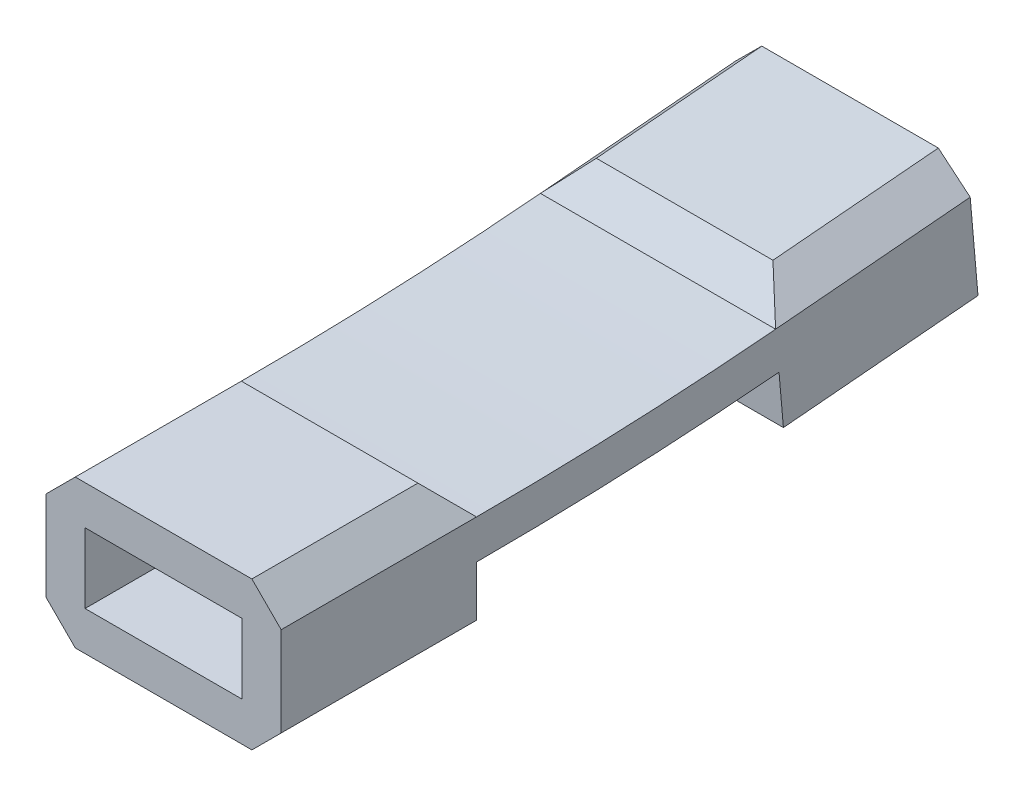
ISO-10303-21;
HEADER;
FILE_DESCRIPTION(('STEP AP214'),'2;1');
FILE_NAME('part.step','',(''),(''),'','','');
FILE_SCHEMA(('AUTOMOTIVE_DESIGN { 1 0 10303 214 1 1 1 1 }'));
ENDSEC;
DATA;
#1=APPLICATION_CONTEXT('core data for automotive mechanical design processes');
#2=APPLICATION_PROTOCOL_DEFINITION('international standard','automotive_design',2000,#1);
#3=PRODUCT_CONTEXT('',#1,'mechanical');
#4=PRODUCT('Part','Part','',(#3));
#5=PRODUCT_RELATED_PRODUCT_CATEGORY('part','',(#4));
#6=PRODUCT_DEFINITION_FORMATION('','',#4);
#7=PRODUCT_DEFINITION_CONTEXT('part definition',#1,'design');
#8=PRODUCT_DEFINITION('design','',#6,#7);
#9=PRODUCT_DEFINITION_SHAPE('','',#8);
#10=(LENGTH_UNIT() NAMED_UNIT(*) SI_UNIT(.MILLI.,.METRE.));
#11=(NAMED_UNIT(*) PLANE_ANGLE_UNIT() SI_UNIT($,.RADIAN.));
#12=(NAMED_UNIT(*) SI_UNIT($,.STERADIAN.) SOLID_ANGLE_UNIT());
#13=UNCERTAINTY_MEASURE_WITH_UNIT(LENGTH_MEASURE(1.E-05),#10,'distance_accuracy_value','');
#14=(GEOMETRIC_REPRESENTATION_CONTEXT(3) GLOBAL_UNCERTAINTY_ASSIGNED_CONTEXT((#13)) GLOBAL_UNIT_ASSIGNED_CONTEXT((#10,
#11,#12)) REPRESENTATION_CONTEXT('',''));
#15=CARTESIAN_POINT('',(0.,0.,0.));
#16=DIRECTION('',(0.,0.,1.));
#17=DIRECTION('',(1.,0.,0.));
#18=AXIS2_PLACEMENT_3D('',#15,#16,#17);
#19=CARTESIAN_POINT('',(0.,0.,8.));
#20=DIRECTION('',(0.,0.,1.));
#21=DIRECTION('',(1.,0.,0.));
#22=AXIS2_PLACEMENT_3D('',#19,#20,#21);
#23=PLANE('',#22);
#24=DIRECTION('',(0.,-1.,0.));
#25=VECTOR('',#24,1.);
#26=CARTESIAN_POINT('',(-6.02,3.79,8.));
#27=LINE('',#26,#25);
#28=CARTESIAN_POINT('',(-6.02,2.29,8.));
#29=VERTEX_POINT('',#28);
#30=CARTESIAN_POINT('',(-6.02,-2.29,8.));
#31=VERTEX_POINT('',#30);
#32=EDGE_CURVE('E332',#29,#31,#27,.T.);
#33=ORIENTED_EDGE('',*,*,#32,.T.);
#34=DIRECTION('',(-0.707106781186548,0.707106781186547,0.));
#35=VECTOR('',#34,1.);
#36=CARTESIAN_POINT('',(-4.15499999999999,-4.155,8.));
#37=LINE('',#36,#35);
#38=CARTESIAN_POINT('',(-4.52,-3.79,8.));
#39=VERTEX_POINT('',#38);
#40=EDGE_CURVE('E395',#31,#39,#37,.F.);
#41=ORIENTED_EDGE('',*,*,#40,.T.);
#42=DIRECTION('',(1.,0.,0.));
#43=VECTOR('',#42,1.);
#44=CARTESIAN_POINT('',(-6.02,-3.79,8.));
#45=LINE('',#44,#43);
#46=CARTESIAN_POINT('',(4.52,-3.79,8.));
#47=VERTEX_POINT('',#46);
#48=EDGE_CURVE('E335',#39,#47,#45,.T.);
#49=ORIENTED_EDGE('',*,*,#48,.T.);
#50=DIRECTION('',(-0.707106781186548,-0.707106781186547,0.));
#51=VECTOR('',#50,1.);
#52=CARTESIAN_POINT('',(4.15499999999999,-4.155,8.));
#53=LINE('',#52,#51);
#54=CARTESIAN_POINT('',(6.02,-2.29,8.));
#55=VERTEX_POINT('',#54);
#56=EDGE_CURVE('E393',#47,#55,#53,.F.);
#57=ORIENTED_EDGE('',*,*,#56,.T.);
#58=DIRECTION('',(0.,1.,0.));
#59=VECTOR('',#58,1.);
#60=CARTESIAN_POINT('',(6.02,3.79,8.));
#61=LINE('',#60,#59);
#62=CARTESIAN_POINT('',(6.02,2.29,8.));
#63=VERTEX_POINT('',#62);
#64=EDGE_CURVE('E326',#55,#63,#61,.T.);
#65=ORIENTED_EDGE('',*,*,#64,.T.);
#66=DIRECTION('',(0.707106781186549,-0.707106781186546,0.));
#67=VECTOR('',#66,1.);
#68=CARTESIAN_POINT('',(4.15499999999999,4.15500000000001,8.));
#69=LINE('',#68,#67);
#70=CARTESIAN_POINT('',(4.52,3.79,8.));
#71=VERTEX_POINT('',#70);
#72=EDGE_CURVE('E391',#63,#71,#69,.F.);
#73=ORIENTED_EDGE('',*,*,#72,.T.);
#74=DIRECTION('',(-1.,0.,0.));
#75=VECTOR('',#74,1.);
#76=CARTESIAN_POINT('',(-6.02,3.79,8.));
#77=LINE('',#76,#75);
#78=CARTESIAN_POINT('',(-4.52,3.79,8.));
#79=VERTEX_POINT('',#78);
#80=EDGE_CURVE('E329',#71,#79,#77,.T.);
#81=ORIENTED_EDGE('',*,*,#80,.T.);
#82=DIRECTION('',(0.707106781186549,0.707106781186546,0.));
#83=VECTOR('',#82,1.);
#84=CARTESIAN_POINT('',(-4.15499999999999,4.15500000000001,8.));
#85=LINE('',#84,#83);
#86=EDGE_CURVE('E389',#79,#29,#85,.F.);
#87=ORIENTED_EDGE('',*,*,#86,.T.);
#88=EDGE_LOOP('',(#33,#41,#49,#57,#65,#73,#81,#87));
#89=FACE_BOUND('',#88,.T.);
#90=DIRECTION('',(1.,0.,0.));
#91=VECTOR('',#90,1.);
#92=CARTESIAN_POINT('',(4.02,-1.79,8.));
#93=LINE('',#92,#91);
#94=CARTESIAN_POINT('',(-4.02,-1.79,8.));
#95=VERTEX_POINT('',#94);
#96=CARTESIAN_POINT('',(4.02,-1.79,8.));
#97=VERTEX_POINT('',#96);
#98=EDGE_CURVE('E299',#95,#97,#93,.T.);
#99=ORIENTED_EDGE('',*,*,#98,.F.);
#100=DIRECTION('',(0.,-1.,0.));
#101=VECTOR('',#100,1.);
#102=CARTESIAN_POINT('',(-4.02,-1.79,8.));
#103=LINE('',#102,#101);
#104=CARTESIAN_POINT('',(-4.02,1.79,8.));
#105=VERTEX_POINT('',#104);
#106=EDGE_CURVE('E297',#105,#95,#103,.T.);
#107=ORIENTED_EDGE('',*,*,#106,.F.);
#108=DIRECTION('',(-1.,0.,0.));
#109=VECTOR('',#108,1.);
#110=CARTESIAN_POINT('',(4.02,1.79,8.));
#111=LINE('',#110,#109);
#112=CARTESIAN_POINT('',(4.02,1.79,8.));
#113=VERTEX_POINT('',#112);
#114=EDGE_CURVE('E305',#113,#105,#111,.T.);
#115=ORIENTED_EDGE('',*,*,#114,.F.);
#116=DIRECTION('',(0.,1.,0.));
#117=VECTOR('',#116,1.);
#118=CARTESIAN_POINT('',(4.02,-1.79,8.));
#119=LINE('',#118,#117);
#120=EDGE_CURVE('E302',#97,#113,#119,.T.);
#121=ORIENTED_EDGE('',*,*,#120,.F.);
#122=EDGE_LOOP('',(#99,#107,#115,#121));
#123=FACE_BOUND('',#122,.T.);
#124=ADVANCED_FACE('F45',(#89,#123),#23,.T.);
#125=CARTESIAN_POINT('',(6.02,3.79,8.));
#126=DIRECTION('',(-1.,0.,0.));
#127=DIRECTION('',(0.,0.,1.));
#128=AXIS2_PLACEMENT_3D('',#125,#126,#127);
#129=PLANE('',#128);
#130=DIRECTION('',(0.,0.996194698091746,0.0871557427476519));
#131=VECTOR('',#130,1.);
#132=CARTESIAN_POINT('',(6.02,2.39703672718649,-27.3982551633835));
#133=LINE('',#132,#131);
#134=CARTESIAN_POINT('',(6.02,-0.732523221810741,-27.6720561807455));
#135=VERTEX_POINT('',#134);
#136=CARTESIAN_POINT('',(6.02,3.83004849544945,-27.2728828789612));
#137=VERTEX_POINT('',#136);
#138=EDGE_CURVE('E247',#135,#137,#133,.T.);
#139=ORIENTED_EDGE('',*,*,#138,.T.);
#140=DIRECTION('',(0.,-0.0871557427476518,0.996194698091746));
#141=VECTOR('',#140,1.);
#142=CARTESIAN_POINT('',(6.02,2.95849106797294,-17.3109358980438));
#143=LINE('',#142,#141);
#144=CARTESIAN_POINT('',(6.02,2.95849106797316,-17.3109358980438));
#145=VERTEX_POINT('',#144);
#146=EDGE_CURVE('E371',#137,#145,#143,.T.);
#147=ORIENTED_EDGE('',*,*,#146,.T.);
#148=CARTESIAN_POINT('',(6.02,177.962981760271,-2.));
#149=DIRECTION('',(1.,0.,0.));
#150=DIRECTION('',(0.,-1.,0.));
#151=AXIS2_PLACEMENT_3D('',#148,#149,#150);
#152=CIRCLE('',#151,175.672981760271);
#153=CARTESIAN_POINT('',(6.02,2.28999999999985,-2.));
#154=VERTEX_POINT('',#153);
#155=EDGE_CURVE('E281',#154,#145,#152,.T.);
#156=ORIENTED_EDGE('',*,*,#155,.F.);
#157=DIRECTION('',(0.,0.,1.));
#158=VECTOR('',#157,1.);
#159=CARTESIAN_POINT('',(6.02,2.29,8.));
#160=LINE('',#159,#158);
#161=EDGE_CURVE('E365',#154,#63,#160,.T.);
#162=ORIENTED_EDGE('',*,*,#161,.T.);
#163=ORIENTED_EDGE('',*,*,#64,.F.);
#164=DIRECTION('',(0.,0.,-1.));
#165=VECTOR('',#164,1.);
#166=CARTESIAN_POINT('',(6.02,-2.29,8.));
#167=LINE('',#166,#165);
#168=CARTESIAN_POINT('',(6.02,-2.29,-2.));
#169=VERTEX_POINT('',#168);
#170=EDGE_CURVE('E367',#55,#169,#167,.T.);
#171=ORIENTED_EDGE('',*,*,#170,.T.);
#172=DIRECTION('',(0.,-1.,0.));
#173=VECTOR('',#172,1.);
#174=CARTESIAN_POINT('',(6.02,0.,-2.));
#175=LINE('',#174,#173);
#176=CARTESIAN_POINT('',(6.02,0.289999999999999,-2.));
#177=VERTEX_POINT('',#176);
#178=EDGE_CURVE('E278',#177,#169,#175,.T.);
#179=ORIENTED_EDGE('',*,*,#178,.F.);
#180=CARTESIAN_POINT('',(6.02,177.962981760271,-2.));
#181=DIRECTION('',(1.,0.,0.));
#182=DIRECTION('',(0.,0.,-1.));
#183=AXIS2_PLACEMENT_3D('',#180,#181,#182);
#184=CIRCLE('',#183,177.672981760271);
#185=CARTESIAN_POINT('',(6.02,0.966101671789676,-17.4852473835391));
#186=VERTEX_POINT('',#185);
#187=EDGE_CURVE('E284',#177,#186,#184,.T.);
#188=ORIENTED_EDGE('',*,*,#187,.T.);
#189=DIRECTION('',(0.,-0.996194698091746,-0.0871557427476509));
#190=VECTOR('',#189,1.);
#191=CARTESIAN_POINT('',(6.02,0.966101671789449,-17.4852473835391));
#192=LINE('',#191,#190);
#193=CARTESIAN_POINT('',(6.02,-1.60408064928725,-17.710109199828));
#194=VERTEX_POINT('',#193);
#195=EDGE_CURVE('E268',#186,#194,#192,.T.);
#196=ORIENTED_EDGE('',*,*,#195,.T.);
#197=DIRECTION('',(0.,0.0871557427476509,-0.996194698091746));
#198=VECTOR('',#197,1.);
#199=CARTESIAN_POINT('',(6.02,-3.79536335162301,7.33636669800804));
#200=LINE('',#199,#198);
#201=EDGE_CURVE('E369',#194,#135,#200,.T.);
#202=ORIENTED_EDGE('',*,*,#201,.T.);
#203=EDGE_LOOP('',(#139,#147,#156,#162,#163,#171,#179,#188,#196,#202));
#204=FACE_BOUND('',#203,.T.);
#205=ADVANCED_FACE('F435',(#204),#129,.F.);
#206=CARTESIAN_POINT('',(-6.02,3.79,8.));
#207=DIRECTION('',(0.,-1.,0.));
#208=DIRECTION('',(0.,0.,-1.));
#209=AXIS2_PLACEMENT_3D('',#206,#207,#208);
#210=PLANE('',#209);
#211=ORIENTED_EDGE('',*,*,#80,.F.);
#212=DIRECTION('',(0.,0.,-1.));
#213=VECTOR('',#212,1.);
#214=CARTESIAN_POINT('',(4.52,3.79,8.));
#215=LINE('',#214,#213);
#216=CARTESIAN_POINT('',(4.52,3.79,-0.499999999999998));
#217=VERTEX_POINT('',#216);
#218=EDGE_CURVE('E11',#71,#217,#215,.T.);
#219=ORIENTED_EDGE('',*,*,#218,.T.);
#220=DIRECTION('',(-1.,0.,0.));
#221=VECTOR('',#220,1.);
#222=CARTESIAN_POINT('',(-6.02,3.79,-0.499999999999999));
#223=LINE('',#222,#221);
#224=CARTESIAN_POINT('',(-4.52,3.79,-0.499999999999998));
#225=VERTEX_POINT('',#224);
#226=EDGE_CURVE('E55',#217,#225,#223,.T.);
#227=ORIENTED_EDGE('',*,*,#226,.T.);
#228=DIRECTION('',(0.,0.,1.));
#229=VECTOR('',#228,1.);
#230=CARTESIAN_POINT('',(-4.52,3.79,8.));
#231=LINE('',#230,#229);
#232=EDGE_CURVE('E399',#225,#79,#231,.T.);
#233=ORIENTED_EDGE('',*,*,#232,.T.);
#234=EDGE_LOOP('',(#211,#219,#227,#233));
#235=FACE_BOUND('',#234,.T.);
#236=ADVANCED_FACE('F426',(#235),#210,.F.);
#237=CARTESIAN_POINT('',(-6.02,3.79,8.));
#238=DIRECTION('',(1.,0.,0.));
#239=DIRECTION('',(0.,0.,-1.));
#240=AXIS2_PLACEMENT_3D('',#237,#238,#239);
#241=PLANE('',#240);
#242=CARTESIAN_POINT('',(-6.02,177.962981760271,-2.));
#243=DIRECTION('',(1.,0.,0.));
#244=DIRECTION('',(0.,0.,-1.));
#245=AXIS2_PLACEMENT_3D('',#242,#243,#244);
#246=CIRCLE('',#245,175.672981760271);
#247=CARTESIAN_POINT('',(-6.02,2.95849106797316,-17.3109358980438));
#248=VERTEX_POINT('',#247);
#249=CARTESIAN_POINT('',(-6.02,2.28999999999985,-2.));
#250=VERTEX_POINT('',#249);
#251=EDGE_CURVE('E269',#248,#250,#246,.F.);
#252=ORIENTED_EDGE('',*,*,#251,.F.);
#253=DIRECTION('',(0.,0.0871557427476518,-0.996194698091746));
#254=VECTOR('',#253,1.);
#255=CARTESIAN_POINT('',(-6.02,3.83004849544945,-27.2728828789612));
#256=LINE('',#255,#254);
#257=CARTESIAN_POINT('',(-6.02,3.83004849544945,-27.2728828789612));
#258=VERTEX_POINT('',#257);
#259=EDGE_CURVE('E355',#248,#258,#256,.T.);
#260=ORIENTED_EDGE('',*,*,#259,.T.);
#261=DIRECTION('',(0.,-0.996194698091746,-0.0871557427476519));
#262=VECTOR('',#261,1.);
#263=CARTESIAN_POINT('',(-6.02,2.39703672718649,-27.3982551633835));
#264=LINE('',#263,#262);
#265=CARTESIAN_POINT('',(-6.02,-0.732523221810741,-27.6720561807455));
#266=VERTEX_POINT('',#265);
#267=EDGE_CURVE('E460',#258,#266,#264,.T.);
#268=ORIENTED_EDGE('',*,*,#267,.T.);
#269=DIRECTION('',(0.,-0.0871557427476509,0.996194698091746));
#270=VECTOR('',#269,1.);
#271=CARTESIAN_POINT('',(-6.02,-3.79536335162301,7.33636669800804));
#272=LINE('',#271,#270);
#273=CARTESIAN_POINT('',(-6.02,-1.60408064928725,-17.710109199828));
#274=VERTEX_POINT('',#273);
#275=EDGE_CURVE('E353',#266,#274,#272,.T.);
#276=ORIENTED_EDGE('',*,*,#275,.T.);
#277=DIRECTION('',(0.,0.996194698091746,0.0871557427476509));
#278=VECTOR('',#277,1.);
#279=CARTESIAN_POINT('',(-6.02,0.966101671789449,-17.4852473835391));
#280=LINE('',#279,#278);
#281=CARTESIAN_POINT('',(-6.02,0.966101671789649,-17.4852473835391));
#282=VERTEX_POINT('',#281);
#283=EDGE_CURVE('E276',#274,#282,#280,.T.);
#284=ORIENTED_EDGE('',*,*,#283,.T.);
#285=CARTESIAN_POINT('',(-6.02,177.962981760271,-2.));
#286=DIRECTION('',(1.,0.,0.));
#287=DIRECTION('',(0.,0.,-1.));
#288=AXIS2_PLACEMENT_3D('',#285,#286,#287);
#289=CIRCLE('',#288,177.672981760271);
#290=CARTESIAN_POINT('',(-6.02,0.289999999999846,-2.));
#291=VERTEX_POINT('',#290);
#292=EDGE_CURVE('E272',#282,#291,#289,.F.);
#293=ORIENTED_EDGE('',*,*,#292,.T.);
#294=DIRECTION('',(0.,-1.,0.));
#295=VECTOR('',#294,1.);
#296=CARTESIAN_POINT('',(-6.02,0.,-2.));
#297=LINE('',#296,#295);
#298=CARTESIAN_POINT('',(-6.02,-2.29,-2.));
#299=VERTEX_POINT('',#298);
#300=EDGE_CURVE('E293',#291,#299,#297,.T.);
#301=ORIENTED_EDGE('',*,*,#300,.T.);
#302=DIRECTION('',(0.,0.,1.));
#303=VECTOR('',#302,1.);
#304=CARTESIAN_POINT('',(-6.02,-2.29,8.));
#305=LINE('',#304,#303);
#306=EDGE_CURVE('E351',#299,#31,#305,.T.);
#307=ORIENTED_EDGE('',*,*,#306,.T.);
#308=ORIENTED_EDGE('',*,*,#32,.F.);
#309=DIRECTION('',(0.,0.,-1.));
#310=VECTOR('',#309,1.);
#311=CARTESIAN_POINT('',(-6.02,2.29,8.));
#312=LINE('',#311,#310);
#313=EDGE_CURVE('E349',#29,#250,#312,.T.);
#314=ORIENTED_EDGE('',*,*,#313,.T.);
#315=EDGE_LOOP('',(#252,#260,#268,#276,#284,#293,#301,#307,#308,#314));
#316=FACE_BOUND('',#315,.T.);
#317=ADVANCED_FACE('F459',(#316),#241,.F.);
#318=CARTESIAN_POINT('',(-6.02,-3.79,8.));
#319=DIRECTION('',(0.,1.,0.));
#320=DIRECTION('',(0.,0.,1.));
#321=AXIS2_PLACEMENT_3D('',#318,#319,#320);
#322=PLANE('',#321);
#323=ORIENTED_EDGE('',*,*,#48,.F.);
#324=DIRECTION('',(0.,0.,-1.));
#325=VECTOR('',#324,1.);
#326=CARTESIAN_POINT('',(-4.52,-3.79,8.));
#327=LINE('',#326,#325);
#328=CARTESIAN_POINT('',(-4.52,-3.79,-0.499999999999995));
#329=VERTEX_POINT('',#328);
#330=EDGE_CURVE('E386',#39,#329,#327,.T.);
#331=ORIENTED_EDGE('',*,*,#330,.T.);
#332=DIRECTION('',(1.,0.,0.));
#333=VECTOR('',#332,1.);
#334=CARTESIAN_POINT('',(-6.02,-3.79,-0.499999999999995));
#335=LINE('',#334,#333);
#336=CARTESIAN_POINT('',(4.52,-3.79,-0.499999999999995));
#337=VERTEX_POINT('',#336);
#338=EDGE_CURVE('E384',#329,#337,#335,.T.);
#339=ORIENTED_EDGE('',*,*,#338,.T.);
#340=DIRECTION('',(0.,0.,1.));
#341=VECTOR('',#340,1.);
#342=CARTESIAN_POINT('',(4.52,-3.79,8.));
#343=LINE('',#342,#341);
#344=EDGE_CURVE('E382',#337,#47,#343,.T.);
#345=ORIENTED_EDGE('',*,*,#344,.T.);
#346=EDGE_LOOP('',(#323,#331,#339,#345));
#347=FACE_BOUND('',#346,.T.);
#348=ADVANCED_FACE('F515',(#347),#322,.F.);
#349=CARTESIAN_POINT('',(-4.02,-1.79,8.));
#350=DIRECTION('',(1.,0.,0.));
#351=DIRECTION('',(0.,0.,-1.));
#352=AXIS2_PLACEMENT_3D('',#349,#350,#351);
#353=PLANE('',#352);
#354=DIRECTION('',(0.,-1.,0.));
#355=VECTOR('',#354,1.);
#356=CARTESIAN_POINT('',(-4.02,-1.79,0.));
#357=LINE('',#356,#355);
#358=CARTESIAN_POINT('',(-4.02,1.79,0.));
#359=VERTEX_POINT('',#358);
#360=CARTESIAN_POINT('',(-4.02,-1.79,0.));
#361=VERTEX_POINT('',#360);
#362=EDGE_CURVE('E296',#359,#361,#357,.T.);
#363=ORIENTED_EDGE('',*,*,#362,.F.);
#364=DIRECTION('',(0.,0.,-1.));
#365=VECTOR('',#364,1.);
#366=CARTESIAN_POINT('',(-4.02,1.79,8.));
#367=LINE('',#366,#365);
#368=EDGE_CURVE('E307',#105,#359,#367,.T.);
#369=ORIENTED_EDGE('',*,*,#368,.F.);
#370=ORIENTED_EDGE('',*,*,#106,.T.);
#371=DIRECTION('',(0.,0.,-1.));
#372=VECTOR('',#371,1.);
#373=CARTESIAN_POINT('',(-4.02,-1.79,8.));
#374=LINE('',#373,#372);
#375=EDGE_CURVE('E323',#95,#361,#374,.T.);
#376=ORIENTED_EDGE('',*,*,#375,.T.);
#377=EDGE_LOOP('',(#363,#369,#370,#376));
#378=FACE_BOUND('',#377,.T.);
#379=ADVANCED_FACE('F538',(#378),#353,.T.);
#380=CARTESIAN_POINT('',(4.02,-1.79,8.));
#381=DIRECTION('',(0.,1.,0.));
#382=DIRECTION('',(0.,0.,1.));
#383=AXIS2_PLACEMENT_3D('',#380,#381,#382);
#384=PLANE('',#383);
#385=DIRECTION('',(1.,0.,0.));
#386=VECTOR('',#385,1.);
#387=CARTESIAN_POINT('',(4.02,-1.79,0.));
#388=LINE('',#387,#386);
#389=CARTESIAN_POINT('',(4.02,-1.79,0.));
#390=VERTEX_POINT('',#389);
#391=EDGE_CURVE('E310',#361,#390,#388,.T.);
#392=ORIENTED_EDGE('',*,*,#391,.F.);
#393=ORIENTED_EDGE('',*,*,#375,.F.);
#394=ORIENTED_EDGE('',*,*,#98,.T.);
#395=DIRECTION('',(0.,0.,-1.));
#396=VECTOR('',#395,1.);
#397=CARTESIAN_POINT('',(4.02,-1.79,8.));
#398=LINE('',#397,#396);
#399=EDGE_CURVE('E321',#97,#390,#398,.T.);
#400=ORIENTED_EDGE('',*,*,#399,.T.);
#401=EDGE_LOOP('',(#392,#393,#394,#400));
#402=FACE_BOUND('',#401,.T.);
#403=ADVANCED_FACE('F772',(#402),#384,.T.);
#404=CARTESIAN_POINT('',(4.02,-1.79,8.));
#405=DIRECTION('',(-1.,0.,0.));
#406=DIRECTION('',(0.,0.,1.));
#407=AXIS2_PLACEMENT_3D('',#404,#405,#406);
#408=PLANE('',#407);
#409=DIRECTION('',(0.,1.,0.));
#410=VECTOR('',#409,1.);
#411=CARTESIAN_POINT('',(4.02,-1.79,0.));
#412=LINE('',#411,#410);
#413=CARTESIAN_POINT('',(4.02,1.79,0.));
#414=VERTEX_POINT('',#413);
#415=EDGE_CURVE('E313',#390,#414,#412,.T.);
#416=ORIENTED_EDGE('',*,*,#415,.F.);
#417=ORIENTED_EDGE('',*,*,#399,.F.);
#418=ORIENTED_EDGE('',*,*,#120,.T.);
#419=DIRECTION('',(0.,0.,-1.));
#420=VECTOR('',#419,1.);
#421=CARTESIAN_POINT('',(4.02,1.79,8.));
#422=LINE('',#421,#420);
#423=EDGE_CURVE('E319',#113,#414,#422,.T.);
#424=ORIENTED_EDGE('',*,*,#423,.T.);
#425=EDGE_LOOP('',(#416,#417,#418,#424));
#426=FACE_BOUND('',#425,.T.);
#427=ADVANCED_FACE('F760',(#426),#408,.T.);
#428=CARTESIAN_POINT('',(4.02,1.79,8.));
#429=DIRECTION('',(0.,-1.,0.));
#430=DIRECTION('',(0.,0.,-1.));
#431=AXIS2_PLACEMENT_3D('',#428,#429,#430);
#432=PLANE('',#431);
#433=DIRECTION('',(-1.,0.,0.));
#434=VECTOR('',#433,1.);
#435=CARTESIAN_POINT('',(4.02,1.79,0.));
#436=LINE('',#435,#434);
#437=EDGE_CURVE('E300',#414,#359,#436,.T.);
#438=ORIENTED_EDGE('',*,*,#437,.F.);
#439=ORIENTED_EDGE('',*,*,#423,.F.);
#440=ORIENTED_EDGE('',*,*,#114,.T.);
#441=ORIENTED_EDGE('',*,*,#368,.T.);
#442=EDGE_LOOP('',(#438,#439,#440,#441));
#443=FACE_BOUND('',#442,.T.);
#444=ADVANCED_FACE('F754',(#443),#432,.T.);
#445=CARTESIAN_POINT('',(0.,0.,0.));
#446=DIRECTION('',(0.,0.,1.));
#447=DIRECTION('',(1.,0.,0.));
#448=AXIS2_PLACEMENT_3D('',#445,#446,#447);
#449=PLANE('',#448);
#450=ORIENTED_EDGE('',*,*,#437,.T.);
#451=ORIENTED_EDGE('',*,*,#362,.T.);
#452=ORIENTED_EDGE('',*,*,#391,.T.);
#453=ORIENTED_EDGE('',*,*,#415,.T.);
#454=EDGE_LOOP('',(#450,#451,#452,#453));
#455=FACE_BOUND('',#454,.T.);
#456=ADVANCED_FACE('F707',(#455),#449,.T.);
#457=CARTESIAN_POINT('',(0.,0.,-2.));
#458=DIRECTION('',(0.,0.,1.));
#459=DIRECTION('',(1.,0.,0.));
#460=AXIS2_PLACEMENT_3D('',#457,#458,#459);
#461=PLANE('',#460);
#462=ORIENTED_EDGE('',*,*,#178,.T.);
#463=DIRECTION('',(-1.,0.,0.));
#464=VECTOR('',#463,1.);
#465=CARTESIAN_POINT('',(0.,-2.29,-2.));
#466=LINE('',#465,#464);
#467=EDGE_CURVE('E397',#169,#299,#466,.T.);
#468=ORIENTED_EDGE('',*,*,#467,.T.);
#469=ORIENTED_EDGE('',*,*,#300,.F.);
#470=DIRECTION('',(1.,0.,0.));
#471=VECTOR('',#470,1.);
#472=CARTESIAN_POINT('',(-27.0304607877791,0.289999999999999,-2.));
#473=LINE('',#472,#471);
#474=EDGE_CURVE('E287',#291,#177,#473,.T.);
#475=ORIENTED_EDGE('',*,*,#474,.T.);
#476=EDGE_LOOP('',(#462,#468,#469,#475));
#477=FACE_BOUND('',#476,.T.);
#478=ADVANCED_FACE('F500',(#477),#461,.F.);
#479=CARTESIAN_POINT('',(-27.0304607877791,177.962981760271,-2.));
#480=DIRECTION('',(1.,0.,0.));
#481=DIRECTION('',(0.,0.,-1.));
#482=AXIS2_PLACEMENT_3D('',#479,#480,#481);
#483=CYLINDRICAL_SURFACE('',#482,175.672981760271);
#484=ORIENTED_EDGE('',*,*,#155,.T.);
#485=DIRECTION('',(1.,0.,0.));
#486=VECTOR('',#485,1.);
#487=CARTESIAN_POINT('',(-27.0304607877791,2.95849106797316,-17.3109358980438));
#488=LINE('',#487,#486);
#489=EDGE_CURVE('E266',#145,#248,#488,.F.);
#490=ORIENTED_EDGE('',*,*,#489,.T.);
#491=ORIENTED_EDGE('',*,*,#251,.T.);
#492=DIRECTION('',(1.,0.,0.));
#493=VECTOR('',#492,1.);
#494=CARTESIAN_POINT('',(-27.0304607877791,2.28999999999985,-2.));
#495=LINE('',#494,#493);
#496=EDGE_CURVE('E338',#250,#154,#495,.T.);
#497=ORIENTED_EDGE('',*,*,#496,.T.);
#498=EDGE_LOOP('',(#484,#490,#491,#497));
#499=FACE_BOUND('',#498,.T.);
#500=ADVANCED_FACE('F440',(#499),#483,.F.);
#501=CARTESIAN_POINT('',(-27.0304607877791,-2.92406121092958,-19.833232210133));
#502=DIRECTION('',(0.,0.996194698091746,0.0871557427476509));
#503=DIRECTION('',(0.,-0.0871557427476509,0.996194698091746));
#504=AXIS2_PLACEMENT_3D('',#501,#502,#503);
#505=PLANE('',#504);
#506=DIRECTION('',(1.,0.,0.));
#507=VECTOR('',#506,1.);
#508=CARTESIAN_POINT('',(0.,-2.22681526894836,-27.802789794867));
#509=LINE('',#508,#507);
#510=CARTESIAN_POINT('',(-4.52,-2.22681526894836,-27.802789794867));
#511=VERTEX_POINT('',#510);
#512=CARTESIAN_POINT('',(4.52,-2.22681526894836,-27.802789794867));
#513=VERTEX_POINT('',#512);
#514=EDGE_CURVE('E250',#511,#513,#509,.T.);
#515=ORIENTED_EDGE('',*,*,#514,.T.);
#516=DIRECTION('',(0.,-0.0871557427476509,0.996194698091746));
#517=VECTOR('',#516,1.);
#518=CARTESIAN_POINT('',(4.52,-2.92406121092958,-19.833232210133));
#519=LINE('',#518,#517);
#520=CARTESIAN_POINT('',(4.52,-2.9676390823034,-19.3351348610871));
#521=VERTEX_POINT('',#520);
#522=EDGE_CURVE('E377',#513,#521,#519,.T.);
#523=ORIENTED_EDGE('',*,*,#522,.T.);
#524=DIRECTION('',(-1.,0.,0.));
#525=VECTOR('',#524,1.);
#526=CARTESIAN_POINT('',(-6.02,-2.9676390823034,-19.3351348610871));
#527=LINE('',#526,#525);
#528=CARTESIAN_POINT('',(-4.52,-2.9676390823034,-19.3351348610871));
#529=VERTEX_POINT('',#528);
#530=EDGE_CURVE('E375',#521,#529,#527,.T.);
#531=ORIENTED_EDGE('',*,*,#530,.T.);
#532=DIRECTION('',(0.,0.0871557427476509,-0.996194698091746));
#533=VECTOR('',#532,1.);
#534=CARTESIAN_POINT('',(-4.52,-2.92406121092958,-19.833232210133));
#535=LINE('',#534,#533);
#536=EDGE_CURVE('E373',#529,#511,#535,.T.);
#537=ORIENTED_EDGE('',*,*,#536,.T.);
#538=EDGE_LOOP('',(#515,#523,#531,#537));
#539=FACE_BOUND('',#538,.T.);
#540=ADVANCED_FACE('F487',(#539),#505,.F.);
#541=CARTESIAN_POINT('',(-27.0304607877791,177.962981760271,-2.));
#542=DIRECTION('',(1.,0.,0.));
#543=DIRECTION('',(0.,0.,-1.));
#544=AXIS2_PLACEMENT_3D('',#541,#542,#543);
#545=CYLINDRICAL_SURFACE('',#544,177.672981760271);
#546=ORIENTED_EDGE('',*,*,#292,.F.);
#547=DIRECTION('',(1.,0.,0.));
#548=VECTOR('',#547,1.);
#549=CARTESIAN_POINT('',(-27.0304607877791,0.966101671789676,-17.4852473835391));
#550=LINE('',#549,#548);
#551=EDGE_CURVE('E273',#282,#186,#550,.T.);
#552=ORIENTED_EDGE('',*,*,#551,.T.);
#553=ORIENTED_EDGE('',*,*,#187,.F.);
#554=ORIENTED_EDGE('',*,*,#474,.F.);
#555=EDGE_LOOP('',(#546,#552,#553,#554));
#556=FACE_BOUND('',#555,.T.);
#557=ADVANCED_FACE('F496',(#556),#545,.T.);
#558=CARTESIAN_POINT('',(-27.0304607877791,0.966101671789449,-17.4852473835391));
#559=DIRECTION('',(0.,-0.0871557427476509,0.996194698091746));
#560=DIRECTION('',(0.,-0.996194698091746,-0.0871557427476509));
#561=AXIS2_PLACEMENT_3D('',#558,#559,#560);
#562=PLANE('',#561);
#563=ORIENTED_EDGE('',*,*,#283,.F.);
#564=DIRECTION('',(1.,0.,0.));
#565=VECTOR('',#564,1.);
#566=CARTESIAN_POINT('',(6.02,-1.60408064928725,-17.710109199828));
#567=LINE('',#566,#565);
#568=EDGE_CURVE('E380',#274,#194,#567,.T.);
#569=ORIENTED_EDGE('',*,*,#568,.T.);
#570=ORIENTED_EDGE('',*,*,#195,.F.);
#571=ORIENTED_EDGE('',*,*,#551,.F.);
#572=EDGE_LOOP('',(#563,#569,#570,#571));
#573=FACE_BOUND('',#572,.T.);
#574=ADVANCED_FACE('F493',(#573),#562,.T.);
#575=CARTESIAN_POINT('',(0.,3.33195114640358,-27.3164607503351));
#576=DIRECTION('',(0.,-0.996194698091746,-0.0871557427476518));
#577=DIRECTION('',(0.,0.0871557427476518,-0.996194698091746));
#578=AXIS2_PLACEMENT_3D('',#575,#576,#577);
#579=PLANE('',#578);
#580=DIRECTION('',(1.,0.,0.));
#581=VECTOR('',#580,1.);
#582=CARTESIAN_POINT('',(-27.0304607877791,2.63470520442237,-19.3469031656011));
#583=LINE('',#582,#581);
#584=CARTESIAN_POINT('',(-4.02,2.63470520442237,-19.3469031656011));
#585=VERTEX_POINT('',#584);
#586=CARTESIAN_POINT('',(4.02,2.63470520442237,-19.3469031656011));
#587=VERTEX_POINT('',#586);
#588=EDGE_CURVE('E340',#585,#587,#583,.T.);
#589=ORIENTED_EDGE('',*,*,#588,.F.);
#590=DIRECTION('',(0.,-0.0871557427476518,0.996194698091746));
#591=VECTOR('',#590,1.);
#592=CARTESIAN_POINT('',(-4.02,3.33195114640358,-27.3164607503351));
#593=LINE('',#592,#591);
#594=CARTESIAN_POINT('',(-4.02,3.33195114640358,-27.3164607503351));
#595=VERTEX_POINT('',#594);
#596=EDGE_CURVE('E257',#595,#585,#593,.T.);
#597=ORIENTED_EDGE('',*,*,#596,.F.);
#598=DIRECTION('',(1.,0.,0.));
#599=VECTOR('',#598,1.);
#600=CARTESIAN_POINT('',(0.,3.33195114640358,-27.3164607503351));
#601=LINE('',#600,#599);
#602=CARTESIAN_POINT('',(4.02,3.33195114640358,-27.3164607503351));
#603=VERTEX_POINT('',#602);
#604=EDGE_CURVE('E241',#595,#603,#601,.T.);
#605=ORIENTED_EDGE('',*,*,#604,.T.);
#606=DIRECTION('',(0.,-0.0871557427476518,0.996194698091746));
#607=VECTOR('',#606,1.);
#608=CARTESIAN_POINT('',(4.02,3.33195114640358,-27.3164607503351));
#609=LINE('',#608,#607);
#610=EDGE_CURVE('E245',#603,#587,#609,.T.);
#611=ORIENTED_EDGE('',*,*,#610,.T.);
#612=EDGE_LOOP('',(#589,#597,#605,#611));
#613=FACE_BOUND('',#612,.T.);
#614=ADVANCED_FACE('F681',(#613),#579,.T.);
#615=CARTESIAN_POINT('',(4.02,2.39703672718649,-27.3982551633835));
#616=DIRECTION('',(1.,0.,0.));
#617=DIRECTION('',(0.,0.,-1.));
#618=AXIS2_PLACEMENT_3D('',#615,#616,#617);
#619=PLANE('',#618);
#620=DIRECTION('',(0.,-0.0871557427476518,0.996194698091746));
#621=VECTOR('',#620,1.);
#622=CARTESIAN_POINT('',(4.02,-0.234425872764868,-27.6284783093717));
#623=LINE('',#622,#621);
#624=CARTESIAN_POINT('',(4.02,-0.234425872764868,-27.6284783093717));
#625=VERTEX_POINT('',#624);
#626=CARTESIAN_POINT('',(4.02,-0.931671814746083,-19.6589207246377));
#627=VERTEX_POINT('',#626);
#628=EDGE_CURVE('E235',#625,#627,#623,.T.);
#629=ORIENTED_EDGE('',*,*,#628,.T.);
#630=DIRECTION('',(0.,0.996194698091746,0.0871557427476509));
#631=VECTOR('',#630,1.);
#632=CARTESIAN_POINT('',(4.02,1.14041315728475,-19.4776367797226));
#633=LINE('',#632,#631);
#634=EDGE_CURVE('E264',#627,#587,#633,.T.);
#635=ORIENTED_EDGE('',*,*,#634,.T.);
#636=ORIENTED_EDGE('',*,*,#610,.F.);
#637=DIRECTION('',(0.,0.996194698091746,0.0871557427476519));
#638=VECTOR('',#637,1.);
#639=CARTESIAN_POINT('',(4.02,2.39703672718649,-27.3982551633835));
#640=LINE('',#639,#638);
#641=EDGE_CURVE('E226',#625,#603,#640,.T.);
#642=ORIENTED_EDGE('',*,*,#641,.F.);
#643=EDGE_LOOP('',(#629,#635,#636,#642));
#644=FACE_BOUND('',#643,.T.);
#645=ADVANCED_FACE('F243',(#644),#619,.F.);
#646=CARTESIAN_POINT('',(-4.02,2.39703672718649,-27.3982551633835));
#647=DIRECTION('',(1.,0.,0.));
#648=DIRECTION('',(0.,0.,-1.));
#649=AXIS2_PLACEMENT_3D('',#646,#647,#648);
#650=PLANE('',#649);
#651=DIRECTION('',(0.,0.996194698091746,0.0871557427476509));
#652=VECTOR('',#651,1.);
#653=CARTESIAN_POINT('',(-4.02,1.14041315728475,-19.4776367797226));
#654=LINE('',#653,#652);
#655=CARTESIAN_POINT('',(-4.02,-0.931671814746083,-19.6589207246377));
#656=VERTEX_POINT('',#655);
#657=EDGE_CURVE('E262',#656,#585,#654,.T.);
#658=ORIENTED_EDGE('',*,*,#657,.F.);
#659=DIRECTION('',(0.,-0.0871557427476518,0.996194698091746));
#660=VECTOR('',#659,1.);
#661=CARTESIAN_POINT('',(-4.02,-0.234425872764868,-27.6284783093717));
#662=LINE('',#661,#660);
#663=CARTESIAN_POINT('',(-4.02,-0.234425872764868,-27.6284783093717));
#664=VERTEX_POINT('',#663);
#665=EDGE_CURVE('E240',#664,#656,#662,.T.);
#666=ORIENTED_EDGE('',*,*,#665,.F.);
#667=DIRECTION('',(0.,0.996194698091746,0.0871557427476519));
#668=VECTOR('',#667,1.);
#669=CARTESIAN_POINT('',(-4.02,2.39703672718649,-27.3982551633835));
#670=LINE('',#669,#668);
#671=EDGE_CURVE('E229',#664,#595,#670,.T.);
#672=ORIENTED_EDGE('',*,*,#671,.T.);
#673=ORIENTED_EDGE('',*,*,#596,.T.);
#674=EDGE_LOOP('',(#658,#666,#672,#673));
#675=FACE_BOUND('',#674,.T.);
#676=ADVANCED_FACE('F829',(#675),#650,.T.);
#677=CARTESIAN_POINT('',(0.,-0.234425872764868,-27.6284783093717));
#678=DIRECTION('',(0.,-0.996194698091746,-0.0871557427476518));
#679=DIRECTION('',(0.,0.0871557427476518,-0.996194698091746));
#680=AXIS2_PLACEMENT_3D('',#677,#678,#679);
#681=PLANE('',#680);
#682=ORIENTED_EDGE('',*,*,#665,.T.);
#683=DIRECTION('',(1.,0.,0.));
#684=VECTOR('',#683,1.);
#685=CARTESIAN_POINT('',(-27.0304607877791,-0.931671814746083,-19.6589207246377));
#686=LINE('',#685,#684);
#687=EDGE_CURVE('E237',#656,#627,#686,.T.);
#688=ORIENTED_EDGE('',*,*,#687,.T.);
#689=ORIENTED_EDGE('',*,*,#628,.F.);
#690=DIRECTION('',(1.,0.,0.));
#691=VECTOR('',#690,1.);
#692=CARTESIAN_POINT('',(0.,-0.234425872764868,-27.6284783093717));
#693=LINE('',#692,#691);
#694=EDGE_CURVE('E221',#664,#625,#693,.T.);
#695=ORIENTED_EDGE('',*,*,#694,.F.);
#696=EDGE_LOOP('',(#682,#688,#689,#695));
#697=FACE_BOUND('',#696,.T.);
#698=ADVANCED_FACE('F236',(#697),#681,.F.);
#699=CARTESIAN_POINT('',(0.,5.32434054258707,-27.1421492648398));
#700=DIRECTION('',(0.,0.996194698091746,0.0871557427476518));
#701=DIRECTION('',(0.,-0.0871557427476518,0.996194698091746));
#702=AXIS2_PLACEMENT_3D('',#699,#700,#701);
#703=PLANE('',#702);
#704=DIRECTION('',(-1.,0.,0.));
#705=VECTOR('',#704,1.);
#706=CARTESIAN_POINT('',(0.,5.32434054258707,-27.1421492648398));
#707=LINE('',#706,#705);
#708=CARTESIAN_POINT('',(4.52,5.32434054258707,-27.1421492648398));
#709=VERTEX_POINT('',#708);
#710=CARTESIAN_POINT('',(-4.52,5.32434054258707,-27.1421492648398));
#711=VERTEX_POINT('',#710);
#712=EDGE_CURVE('E408',#709,#711,#707,.T.);
#713=ORIENTED_EDGE('',*,*,#712,.T.);
#714=DIRECTION('',(0.,-0.0871557427476518,0.996194698091746));
#715=VECTOR('',#714,1.);
#716=CARTESIAN_POINT('',(-4.52,4.45278311511056,-17.1802022839223));
#717=LINE('',#716,#715);
#718=CARTESIAN_POINT('',(-4.52,4.58351672923204,-18.6744943310599));
#719=VERTEX_POINT('',#718);
#720=EDGE_CURVE('E346',#711,#719,#717,.T.);
#721=ORIENTED_EDGE('',*,*,#720,.T.);
#722=DIRECTION('',(1.,0.,0.));
#723=VECTOR('',#722,1.);
#724=CARTESIAN_POINT('',(0.,4.58351672923204,-18.6744943310599));
#725=LINE('',#724,#723);
#726=CARTESIAN_POINT('',(4.52,4.58351672923204,-18.6744943310599));
#727=VERTEX_POINT('',#726);
#728=EDGE_CURVE('E344',#719,#727,#725,.T.);
#729=ORIENTED_EDGE('',*,*,#728,.T.);
#730=DIRECTION('',(0.,0.0871557427476518,-0.996194698091746));
#731=VECTOR('',#730,1.);
#732=CARTESIAN_POINT('',(4.52,5.32434054258707,-27.1421492648398));
#733=LINE('',#732,#731);
#734=EDGE_CURVE('E342',#727,#709,#733,.T.);
#735=ORIENTED_EDGE('',*,*,#734,.T.);
#736=EDGE_LOOP('',(#713,#721,#729,#735));
#737=FACE_BOUND('',#736,.T.);
#738=ADVANCED_FACE('F471',(#737),#703,.T.);
#739=CARTESIAN_POINT('',(0.,2.39703672718649,-27.3982551633835));
#740=DIRECTION('',(0.,-0.0871557427476519,0.996194698091746));
#741=DIRECTION('',(0.,-0.996194698091746,-0.0871557427476519));
#742=AXIS2_PLACEMENT_3D('',#739,#740,#741);
#743=PLANE('',#742);
#744=ORIENTED_EDGE('',*,*,#267,.F.);
#745=DIRECTION('',(0.707106781186548,0.704416026402758,0.0616284167162148));
#746=VECTOR('',#745,1.);
#747=CARTESIAN_POINT('',(-4.52,5.32434054258707,-27.1421492648398));
#748=LINE('',#747,#746);
#749=EDGE_CURVE('E363',#258,#711,#748,.T.);
#750=ORIENTED_EDGE('',*,*,#749,.T.);
#751=ORIENTED_EDGE('',*,*,#712,.F.);
#752=DIRECTION('',(0.707106781186548,-0.704416026402758,-0.0616284167162149));
#753=VECTOR('',#752,1.);
#754=CARTESIAN_POINT('',(6.02,3.83004849544946,-27.2728828789612));
#755=LINE('',#754,#753);
#756=EDGE_CURVE('E361',#709,#137,#755,.T.);
#757=ORIENTED_EDGE('',*,*,#756,.T.);
#758=ORIENTED_EDGE('',*,*,#138,.F.);
#759=DIRECTION('',(0.707106781186546,0.704416026402761,0.061628416716215));
#760=VECTOR('',#759,1.);
#761=CARTESIAN_POINT('',(4.52,-2.22681526894836,-27.802789794867));
#762=LINE('',#761,#760);
#763=EDGE_CURVE('E359',#135,#513,#762,.F.);
#764=ORIENTED_EDGE('',*,*,#763,.T.);
#765=ORIENTED_EDGE('',*,*,#514,.F.);
#766=DIRECTION('',(0.707106781186546,-0.704416026402761,-0.0616284167162151));
#767=VECTOR('',#766,1.);
#768=CARTESIAN_POINT('',(-4.52,-2.22681526894836,-27.802789794867));
#769=LINE('',#768,#767);
#770=EDGE_CURVE('E357',#511,#266,#769,.F.);
#771=ORIENTED_EDGE('',*,*,#770,.T.);
#772=EDGE_LOOP('',(#744,#750,#751,#757,#758,#764,#765,#771));
#773=FACE_BOUND('',#772,.T.);
#774=ORIENTED_EDGE('',*,*,#641,.T.);
#775=ORIENTED_EDGE('',*,*,#604,.F.);
#776=ORIENTED_EDGE('',*,*,#671,.F.);
#777=ORIENTED_EDGE('',*,*,#694,.T.);
#778=EDGE_LOOP('',(#774,#775,#776,#777));
#779=FACE_BOUND('',#778,.T.);
#780=ADVANCED_FACE('F223',(#773,#779),#743,.F.);
#781=CARTESIAN_POINT('',(-27.0304607877791,1.14041315728475,-19.4776367797226));
#782=DIRECTION('',(0.,-0.0871557427476509,0.996194698091746));
#783=DIRECTION('',(0.,-0.996194698091746,-0.0871557427476509));
#784=AXIS2_PLACEMENT_3D('',#781,#782,#783);
#785=PLANE('',#784);
#786=ORIENTED_EDGE('',*,*,#634,.F.);
#787=ORIENTED_EDGE('',*,*,#687,.F.);
#788=ORIENTED_EDGE('',*,*,#657,.T.);
#789=ORIENTED_EDGE('',*,*,#588,.T.);
#790=EDGE_LOOP('',(#786,#787,#788,#789));
#791=FACE_BOUND('',#790,.T.);
#792=ADVANCED_FACE('F561',(#791),#785,.F.);
#793=CARTESIAN_POINT('',(6.02,0.767208365637153,7.73553999979227));
#794=DIRECTION('',(0.707106781186547,0.70441602640276,0.0616284167162149));
#795=DIRECTION('',(0.,0.0871557427476518,-0.996194698091746));
#796=AXIS2_PLACEMENT_3D('',#793,#794,#795);
#797=PLANE('',#796);
#798=ORIENTED_EDGE('',*,*,#756,.F.);
#799=ORIENTED_EDGE('',*,*,#734,.F.);
#800=DIRECTION('',(-0.577350269189625,0.625472668645325,-0.524833885571771));
#801=VECTOR('',#800,1.);
#802=CARTESIAN_POINT('',(14.4007164555997,-6.12076179875102,-9.6925381662103));
#803=LINE('',#802,#801);
#804=EDGE_CURVE('E404',#145,#727,#803,.T.);
#805=ORIENTED_EDGE('',*,*,#804,.F.);
#806=ORIENTED_EDGE('',*,*,#146,.F.);
#807=EDGE_LOOP('',(#798,#799,#805,#806));
#808=FACE_BOUND('',#807,.T.);
#809=ADVANCED_FACE('F446',(#808),#797,.T.);
#810=CARTESIAN_POINT('',(0.,2.95849106797294,-17.3109358980438));
#811=DIRECTION('',(0.,-0.642787609686546,-0.766044443118972));
#812=DIRECTION('',(-1.,0.,0.));
#813=AXIS2_PLACEMENT_3D('',#810,#811,#812);
#814=PLANE('',#813);
#815=ORIENTED_EDGE('',*,*,#804,.T.);
#816=ORIENTED_EDGE('',*,*,#728,.F.);
#817=DIRECTION('',(0.577350269189625,0.625472668645325,-0.524833885571771));
#818=VECTOR('',#817,1.);
#819=CARTESIAN_POINT('',(-4.01333333333334,5.13241428592399,-19.1350740684343));
#820=LINE('',#819,#818);
#821=EDGE_CURVE('E402',#248,#719,#820,.T.);
#822=ORIENTED_EDGE('',*,*,#821,.F.);
#823=ORIENTED_EDGE('',*,*,#489,.F.);
#824=EDGE_LOOP('',(#815,#816,#822,#823));
#825=FACE_BOUND('',#824,.T.);
#826=ADVANCED_FACE('F450',(#825),#814,.F.);
#827=CARTESIAN_POINT('',(-4.52,5.32434054258707,-27.1421492648398));
#828=DIRECTION('',(-0.707106781186547,0.70441602640276,0.0616284167162149));
#829=DIRECTION('',(0.,0.0871557427476518,-0.996194698091746));
#830=AXIS2_PLACEMENT_3D('',#827,#828,#829);
#831=PLANE('',#830);
#832=ORIENTED_EDGE('',*,*,#749,.F.);
#833=ORIENTED_EDGE('',*,*,#259,.F.);
#834=ORIENTED_EDGE('',*,*,#821,.T.);
#835=ORIENTED_EDGE('',*,*,#720,.F.);
#836=EDGE_LOOP('',(#832,#833,#834,#835));
#837=FACE_BOUND('',#836,.T.);
#838=ADVANCED_FACE('F455',(#837),#831,.T.);
#839=CARTESIAN_POINT('',(-4.52,-2.92406121092958,-19.833232210133));
#840=DIRECTION('',(0.707106781186549,0.704416026402757,0.061628416716214));
#841=DIRECTION('',(0.,0.0871557427476509,-0.996194698091746));
#842=AXIS2_PLACEMENT_3D('',#839,#840,#841);
#843=PLANE('',#842);
#844=ORIENTED_EDGE('',*,*,#770,.F.);
#845=ORIENTED_EDGE('',*,*,#536,.F.);
#846=DIRECTION('',(0.577350269189625,-0.524833885571772,-0.625472668645325));
#847=VECTOR('',#846,1.);
#848=CARTESIAN_POINT('',(-4.35333333333333,-3.11914557486075,-19.5156932678937));
#849=LINE('',#848,#847);
#850=EDGE_CURVE('E405',#274,#529,#849,.T.);
#851=ORIENTED_EDGE('',*,*,#850,.F.);
#852=ORIENTED_EDGE('',*,*,#275,.F.);
#853=EDGE_LOOP('',(#844,#845,#851,#852));
#854=FACE_BOUND('',#853,.T.);
#855=ADVANCED_FACE('F489',(#854),#843,.F.);
#856=CARTESIAN_POINT('',(-27.0304607877791,-1.60408064928725,-17.710109199828));
#857=DIRECTION('',(0.,-0.766044443118972,0.642787609686547));
#858=DIRECTION('',(-1.,0.,0.));
#859=AXIS2_PLACEMENT_3D('',#856,#857,#858);
#860=PLANE('',#859);
#861=ORIENTED_EDGE('',*,*,#850,.T.);
#862=ORIENTED_EDGE('',*,*,#530,.F.);
#863=DIRECTION('',(-0.577350269189625,-0.524833885571772,-0.625472668645325));
#864=VECTOR('',#863,1.);
#865=CARTESIAN_POINT('',(-4.99682026259301,-11.6187994320085,-29.6451862879566));
#866=LINE('',#865,#864);
#867=EDGE_CURVE('E409',#194,#521,#866,.T.);
#868=ORIENTED_EDGE('',*,*,#867,.F.);
#869=ORIENTED_EDGE('',*,*,#568,.F.);
#870=EDGE_LOOP('',(#861,#862,#868,#869));
#871=FACE_BOUND('',#870,.T.);
#872=ADVANCED_FACE('F483',(#871),#860,.T.);
#873=CARTESIAN_POINT('',(4.52,-2.92406121092958,-19.833232210133));
#874=DIRECTION('',(-0.707106781186549,0.704416026402758,0.0616284167162141));
#875=DIRECTION('',(0.,-0.0871557427476509,0.996194698091746));
#876=AXIS2_PLACEMENT_3D('',#873,#874,#875);
#877=PLANE('',#876);
#878=ORIENTED_EDGE('',*,*,#763,.F.);
#879=ORIENTED_EDGE('',*,*,#201,.F.);
#880=ORIENTED_EDGE('',*,*,#867,.T.);
#881=ORIENTED_EDGE('',*,*,#522,.F.);
#882=EDGE_LOOP('',(#878,#879,#880,#881));
#883=FACE_BOUND('',#882,.T.);
#884=ADVANCED_FACE('F478',(#883),#877,.F.);
#885=CARTESIAN_POINT('',(6.02,-2.29,8.));
#886=DIRECTION('',(-0.707106781186547,0.707106781186548,0.));
#887=DIRECTION('',(0.,0.,-1.));
#888=AXIS2_PLACEMENT_3D('',#885,#886,#887);
#889=PLANE('',#888);
#890=ORIENTED_EDGE('',*,*,#56,.F.);
#891=ORIENTED_EDGE('',*,*,#344,.F.);
#892=DIRECTION('',(0.577350269189626,0.577350269189625,-0.577350269189626));
#893=VECTOR('',#892,1.);
#894=CARTESIAN_POINT('',(2.68666666666666,-5.62333333333333,1.33333333333334));
#895=LINE('',#894,#893);
#896=EDGE_CURVE('E411',#169,#337,#895,.F.);
#897=ORIENTED_EDGE('',*,*,#896,.F.);
#898=ORIENTED_EDGE('',*,*,#170,.F.);
#899=EDGE_LOOP('',(#890,#891,#897,#898));
#900=FACE_BOUND('',#899,.T.);
#901=ADVANCED_FACE('F518',(#900),#889,.F.);
#902=CARTESIAN_POINT('',(-6.02,-3.79,-0.499999999999995));
#903=DIRECTION('',(0.,0.707106781186548,0.707106781186547));
#904=DIRECTION('',(1.,0.,0.));
#905=AXIS2_PLACEMENT_3D('',#902,#903,#904);
#906=PLANE('',#905);
#907=ORIENTED_EDGE('',*,*,#896,.T.);
#908=ORIENTED_EDGE('',*,*,#338,.F.);
#909=DIRECTION('',(-0.577350269189626,0.577350269189625,-0.577350269189626));
#910=VECTOR('',#909,1.);
#911=CARTESIAN_POINT('',(-5.02,-3.29,-0.999999999999997));
#912=LINE('',#911,#910);
#913=EDGE_CURVE('E414',#299,#329,#912,.F.);
#914=ORIENTED_EDGE('',*,*,#913,.F.);
#915=ORIENTED_EDGE('',*,*,#467,.F.);
#916=EDGE_LOOP('',(#907,#908,#914,#915));
#917=FACE_BOUND('',#916,.T.);
#918=ADVANCED_FACE('F506',(#917),#906,.F.);
#919=CARTESIAN_POINT('',(-4.52,-3.79,8.));
#920=DIRECTION('',(0.707106781186547,0.707106781186548,0.));
#921=DIRECTION('',(0.,0.,-1.));
#922=AXIS2_PLACEMENT_3D('',#919,#920,#921);
#923=PLANE('',#922);
#924=ORIENTED_EDGE('',*,*,#40,.F.);
#925=ORIENTED_EDGE('',*,*,#306,.F.);
#926=ORIENTED_EDGE('',*,*,#913,.T.);
#927=ORIENTED_EDGE('',*,*,#330,.F.);
#928=EDGE_LOOP('',(#924,#925,#926,#927));
#929=FACE_BOUND('',#928,.T.);
#930=ADVANCED_FACE('F511',(#929),#923,.F.);
#931=CARTESIAN_POINT('',(-6.02,2.29,8.));
#932=DIRECTION('',(0.707106781186546,-0.707106781186549,0.));
#933=DIRECTION('',(0.,0.,-1.));
#934=AXIS2_PLACEMENT_3D('',#931,#932,#933);
#935=PLANE('',#934);
#936=ORIENTED_EDGE('',*,*,#86,.F.);
#937=ORIENTED_EDGE('',*,*,#232,.F.);
#938=DIRECTION('',(-0.577350269189627,-0.577350269189624,-0.577350269189627));
#939=VECTOR('',#938,1.);
#940=CARTESIAN_POINT('',(-2.68666666666666,5.62333333333333,1.33333333333334));
#941=LINE('',#940,#939);
#942=EDGE_CURVE('E50',#250,#225,#941,.F.);
#943=ORIENTED_EDGE('',*,*,#942,.F.);
#944=ORIENTED_EDGE('',*,*,#313,.F.);
#945=EDGE_LOOP('',(#936,#937,#943,#944));
#946=FACE_BOUND('',#945,.T.);
#947=ADVANCED_FACE('F48',(#946),#935,.F.);
#948=CARTESIAN_POINT('',(0.,2.29,-2.));
#949=DIRECTION('',(0.,-0.707106781186549,0.707106781186546));
#950=DIRECTION('',(1.,0.,0.));
#951=AXIS2_PLACEMENT_3D('',#948,#949,#950);
#952=PLANE('',#951);
#953=ORIENTED_EDGE('',*,*,#942,.T.);
#954=ORIENTED_EDGE('',*,*,#226,.F.);
#955=DIRECTION('',(0.577350269189627,-0.577350269189624,-0.577350269189627));
#956=VECTOR('',#955,1.);
#957=CARTESIAN_POINT('',(4.01333333333333,4.29666666666667,0.00666666666667391));
#958=LINE('',#957,#956);
#959=EDGE_CURVE('E63',#154,#217,#958,.F.);
#960=ORIENTED_EDGE('',*,*,#959,.F.);
#961=ORIENTED_EDGE('',*,*,#496,.F.);
#962=EDGE_LOOP('',(#953,#954,#960,#961));
#963=FACE_BOUND('',#962,.T.);
#964=ADVANCED_FACE('F421',(#963),#952,.F.);
#965=CARTESIAN_POINT('',(4.52,3.79,8.));
#966=DIRECTION('',(-0.707106781186546,-0.707106781186549,0.));
#967=DIRECTION('',(0.,0.,-1.));
#968=AXIS2_PLACEMENT_3D('',#965,#966,#967);
#969=PLANE('',#968);
#970=ORIENTED_EDGE('',*,*,#72,.F.);
#971=ORIENTED_EDGE('',*,*,#161,.F.);
#972=ORIENTED_EDGE('',*,*,#959,.T.);
#973=ORIENTED_EDGE('',*,*,#218,.F.);
#974=EDGE_LOOP('',(#970,#971,#972,#973));
#975=FACE_BOUND('',#974,.T.);
#976=ADVANCED_FACE('F432',(#975),#969,.F.);
#977=CLOSED_SHELL('',(#124,#205,#236,#317,#348,#379,#403,#427,#444,#456,#478,#500,#540,#557,
#574,#614,#645,#676,#698,#738,#780,#792,#809,#826,#838,#855,#872,#884,#901,#918,#930,#947,#964,#976));
#978=MANIFOLD_SOLID_BREP('B2',#977);
#979=ADVANCED_BREP_SHAPE_REPRESENTATION('',(#18,#978),#14);
#980=SHAPE_DEFINITION_REPRESENTATION(#9,#979);
ENDSEC;
END-ISO-10303-21;
